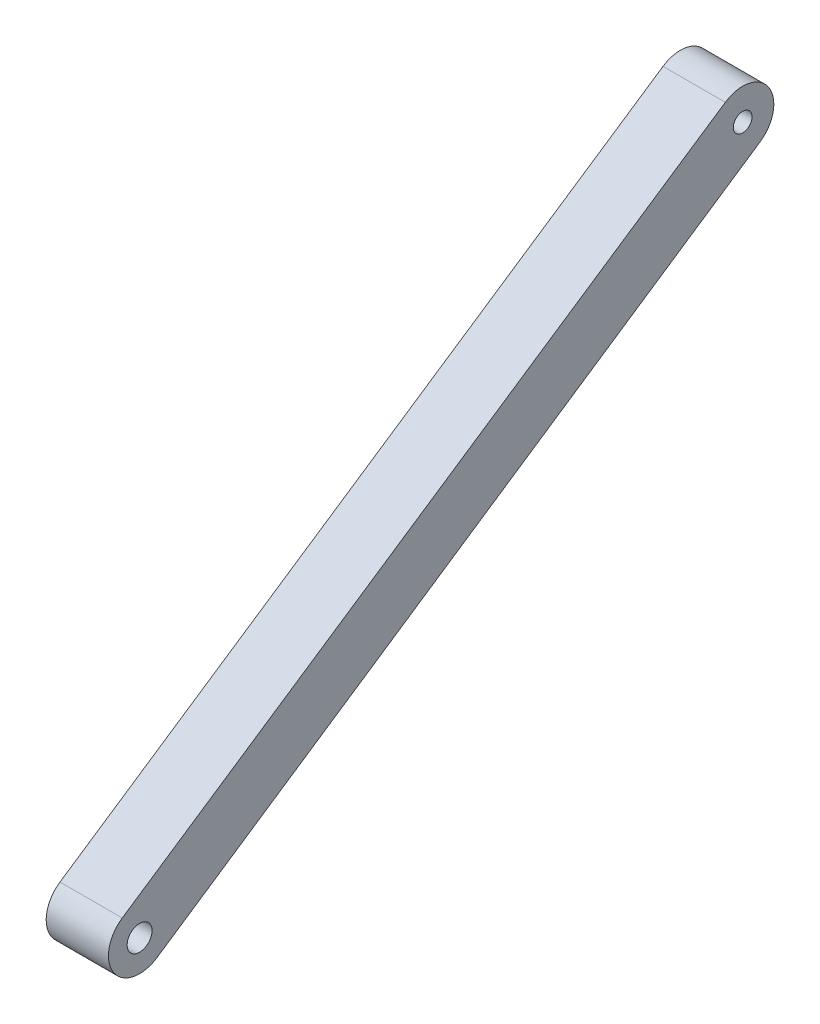
ISO-10303-21;
HEADER;
FILE_DESCRIPTION(('STEP AP214'),'2;1');
FILE_NAME('part.step','',(''),(''),'','','');
FILE_SCHEMA(('AUTOMOTIVE_DESIGN { 1 0 10303 214 1 1 1 1 }'));
ENDSEC;
DATA;
#1=APPLICATION_CONTEXT('core data for automotive mechanical design processes');
#2=APPLICATION_PROTOCOL_DEFINITION('international standard','automotive_design',2000,#1);
#3=PRODUCT_CONTEXT('',#1,'mechanical');
#4=PRODUCT('Part','Part','',(#3));
#5=PRODUCT_RELATED_PRODUCT_CATEGORY('part','',(#4));
#6=PRODUCT_DEFINITION_FORMATION('','',#4);
#7=PRODUCT_DEFINITION_CONTEXT('part definition',#1,'design');
#8=PRODUCT_DEFINITION('design','',#6,#7);
#9=PRODUCT_DEFINITION_SHAPE('','',#8);
#10=(LENGTH_UNIT() NAMED_UNIT(*) SI_UNIT(.MILLI.,.METRE.));
#11=(NAMED_UNIT(*) PLANE_ANGLE_UNIT() SI_UNIT($,.RADIAN.));
#12=(NAMED_UNIT(*) SI_UNIT($,.STERADIAN.) SOLID_ANGLE_UNIT());
#13=UNCERTAINTY_MEASURE_WITH_UNIT(LENGTH_MEASURE(1.E-05),#10,'distance_accuracy_value','');
#14=(GEOMETRIC_REPRESENTATION_CONTEXT(3) GLOBAL_UNCERTAINTY_ASSIGNED_CONTEXT((#13)) GLOBAL_UNIT_ASSIGNED_CONTEXT((#10,
#11,#12)) REPRESENTATION_CONTEXT('',''));
#15=CARTESIAN_POINT('',(0.,0.,0.));
#16=DIRECTION('',(0.,0.,1.));
#17=DIRECTION('',(1.,0.,0.));
#18=AXIS2_PLACEMENT_3D('',#15,#16,#17);
#19=CARTESIAN_POINT('',(-5.,26.553202892204,-27.5965246151337));
#20=DIRECTION('',(1.,0.,0.));
#21=DIRECTION('',(0.,0.,-1.));
#22=AXIS2_PLACEMENT_3D('',#19,#20,#21);
#23=CYLINDRICAL_SURFACE('',#22,5.);
#24=DIRECTION('',(1.,0.,0.));
#25=VECTOR('',#24,1.);
#26=CARTESIAN_POINT('',(-5.,30.7045315820796,-24.8096858848489));
#27=LINE('',#26,#25);
#28=CARTESIAN_POINT('',(-5.,30.7045315820796,-24.8096858848489));
#29=VERTEX_POINT('',#28);
#30=CARTESIAN_POINT('',(5.,30.7045315820796,-24.8096858848489));
#31=VERTEX_POINT('',#30);
#32=EDGE_CURVE('E36',#29,#31,#27,.T.);
#33=ORIENTED_EDGE('',*,*,#32,.T.);
#34=CARTESIAN_POINT('',(5.,26.553202892204,-27.5965246151337));
#35=DIRECTION('',(1.,0.,0.));
#36=DIRECTION('',(0.,0.,-1.));
#37=AXIS2_PLACEMENT_3D('',#34,#35,#36);
#38=CIRCLE('',#37,5.);
#39=CARTESIAN_POINT('',(5.,22.4018742023284,-30.3833633454185));
#40=VERTEX_POINT('',#39);
#41=EDGE_CURVE('E73',#40,#31,#38,.T.);
#42=ORIENTED_EDGE('',*,*,#41,.F.);
#43=DIRECTION('',(1.,0.,0.));
#44=VECTOR('',#43,1.);
#45=CARTESIAN_POINT('',(-5.,22.4018742023284,-30.3833633454185));
#46=LINE('',#45,#44);
#47=CARTESIAN_POINT('',(-5.,22.4018742023284,-30.3833633454185));
#48=VERTEX_POINT('',#47);
#49=EDGE_CURVE('E11',#48,#40,#46,.T.);
#50=ORIENTED_EDGE('',*,*,#49,.F.);
#51=CARTESIAN_POINT('',(-5.,26.553202892204,-27.5965246151337));
#52=DIRECTION('',(1.,0.,0.));
#53=DIRECTION('',(0.,0.,-1.));
#54=AXIS2_PLACEMENT_3D('',#51,#52,#53);
#55=CIRCLE('',#54,5.);
#56=EDGE_CURVE('E74',#48,#29,#55,.T.);
#57=ORIENTED_EDGE('',*,*,#56,.T.);
#58=EDGE_LOOP('',(#33,#42,#50,#57));
#59=FACE_BOUND('',#58,.T.);
#60=ADVANCED_FACE('F33',(#59),#23,.T.);
#61=CARTESIAN_POINT('',(-5.,22.4018742023284,-30.3833633454185));
#62=DIRECTION('',(0.,-0.830265737975125,-0.557367746056965));
#63=DIRECTION('',(0.,0.557367746056965,-0.830265737975125));
#64=AXIS2_PLACEMENT_3D('',#61,#62,#63);
#65=PLANE('',#64);
#66=ORIENTED_EDGE('',*,*,#49,.T.);
#67=DIRECTION('',(0.,0.557367746056965,-0.830265737975125));
#68=VECTOR('',#67,1.);
#69=CARTESIAN_POINT('',(5.,22.4018742023284,-30.3833633454185));
#70=LINE('',#69,#68);
#71=CARTESIAN_POINT('',(5.,-42.602771831482,66.4488103727165));
#72=VERTEX_POINT('',#71);
#73=EDGE_CURVE('E91',#72,#40,#70,.T.);
#74=ORIENTED_EDGE('',*,*,#73,.F.);
#75=DIRECTION('',(1.,0.,0.));
#76=VECTOR('',#75,1.);
#77=CARTESIAN_POINT('',(-5.,-42.602771831482,66.4488103727165));
#78=LINE('',#77,#76);
#79=CARTESIAN_POINT('',(-5.,-42.602771831482,66.4488103727165));
#80=VERTEX_POINT('',#79);
#81=EDGE_CURVE('E41',#80,#72,#78,.T.);
#82=ORIENTED_EDGE('',*,*,#81,.F.);
#83=DIRECTION('',(0.,0.557367746056965,-0.830265737975125));
#84=VECTOR('',#83,1.);
#85=CARTESIAN_POINT('',(-5.,22.4018742023284,-30.3833633454185));
#86=LINE('',#85,#84);
#87=EDGE_CURVE('E79',#80,#48,#86,.T.);
#88=ORIENTED_EDGE('',*,*,#87,.T.);
#89=EDGE_LOOP('',(#66,#74,#82,#88));
#90=FACE_BOUND('',#89,.T.);
#91=ADVANCED_FACE('F117',(#90),#65,.T.);
#92=CARTESIAN_POINT('',(-5.,-38.4514431416064,69.2356491030014));
#93=DIRECTION('',(1.,0.,0.));
#94=DIRECTION('',(0.,0.,-1.));
#95=AXIS2_PLACEMENT_3D('',#92,#93,#94);
#96=CYLINDRICAL_SURFACE('',#95,5.);
#97=ORIENTED_EDGE('',*,*,#81,.T.);
#98=CARTESIAN_POINT('',(5.,-38.4514431416064,69.2356491030014));
#99=DIRECTION('',(1.,0.,0.));
#100=DIRECTION('',(0.,0.,-1.));
#101=AXIS2_PLACEMENT_3D('',#98,#99,#100);
#102=CIRCLE('',#101,5.);
#103=CARTESIAN_POINT('',(5.,-34.3001144517308,72.0224878332862));
#104=VERTEX_POINT('',#103);
#105=EDGE_CURVE('E86',#104,#72,#102,.T.);
#106=ORIENTED_EDGE('',*,*,#105,.F.);
#107=DIRECTION('',(1.,0.,0.));
#108=VECTOR('',#107,1.);
#109=CARTESIAN_POINT('',(-5.,-34.3001144517308,72.0224878332862));
#110=LINE('',#109,#108);
#111=CARTESIAN_POINT('',(-5.,-34.3001144517308,72.0224878332862));
#112=VERTEX_POINT('',#111);
#113=EDGE_CURVE('E78',#112,#104,#110,.T.);
#114=ORIENTED_EDGE('',*,*,#113,.F.);
#115=CARTESIAN_POINT('',(-5.,-38.4514431416064,69.2356491030014));
#116=DIRECTION('',(1.,0.,0.));
#117=DIRECTION('',(0.,0.,-1.));
#118=AXIS2_PLACEMENT_3D('',#115,#116,#117);
#119=CIRCLE('',#118,5.);
#120=EDGE_CURVE('E110',#112,#80,#119,.T.);
#121=ORIENTED_EDGE('',*,*,#120,.T.);
#122=EDGE_LOOP('',(#97,#106,#114,#121));
#123=FACE_BOUND('',#122,.T.);
#124=ADVANCED_FACE('F114',(#123),#96,.T.);
#125=CARTESIAN_POINT('',(-5.,30.7045315820796,-24.8096858848489));
#126=DIRECTION('',(0.,0.830265737975125,0.557367746056965));
#127=DIRECTION('',(0.,-0.557367746056965,0.830265737975125));
#128=AXIS2_PLACEMENT_3D('',#125,#126,#127);
#129=PLANE('',#128);
#130=ORIENTED_EDGE('',*,*,#113,.T.);
#131=DIRECTION('',(0.,-0.557367746056965,0.830265737975125));
#132=VECTOR('',#131,1.);
#133=CARTESIAN_POINT('',(5.,30.7045315820796,-24.8096858848489));
#134=LINE('',#133,#132);
#135=EDGE_CURVE('E81',#31,#104,#134,.T.);
#136=ORIENTED_EDGE('',*,*,#135,.F.);
#137=ORIENTED_EDGE('',*,*,#32,.F.);
#138=DIRECTION('',(0.,-0.557367746056965,0.830265737975125));
#139=VECTOR('',#138,1.);
#140=CARTESIAN_POINT('',(-5.,30.7045315820796,-24.8096858848489));
#141=LINE('',#140,#139);
#142=EDGE_CURVE('E108',#29,#112,#141,.T.);
#143=ORIENTED_EDGE('',*,*,#142,.T.);
#144=EDGE_LOOP('',(#130,#136,#137,#143));
#145=FACE_BOUND('',#144,.T.);
#146=ADVANCED_FACE('F82',(#145),#129,.T.);
#147=CARTESIAN_POINT('',(-5.,26.553202892204,-27.5965246151337));
#148=DIRECTION('',(1.,0.,0.));
#149=DIRECTION('',(0.,0.,-1.));
#150=AXIS2_PLACEMENT_3D('',#147,#148,#149);
#151=PLANE('',#150);
#152=CARTESIAN_POINT('',(-5.,-38.4514431416064,69.2356491030014));
#153=DIRECTION('',(1.,0.,0.));
#154=DIRECTION('',(0.,0.,-1.));
#155=AXIS2_PLACEMENT_3D('',#152,#153,#154);
#156=CIRCLE('',#155,2.);
#157=CARTESIAN_POINT('',(-5.,-38.4514431416064,67.2356491030014));
#158=VERTEX_POINT('',#157);
#159=EDGE_CURVE('E101',#158,#158,#156,.T.);
#160=ORIENTED_EDGE('',*,*,#159,.T.);
#161=EDGE_LOOP('',(#160));
#162=FACE_BOUND('',#161,.T.);
#163=CARTESIAN_POINT('',(-5.,26.553202892204,-27.5965246151337));
#164=DIRECTION('',(1.,0.,0.));
#165=DIRECTION('',(0.,0.,-1.));
#166=AXIS2_PLACEMENT_3D('',#163,#164,#165);
#167=CIRCLE('',#166,1.5);
#168=CARTESIAN_POINT('',(-5.,26.553202892204,-29.0965246151337));
#169=VERTEX_POINT('',#168);
#170=EDGE_CURVE('E104',#169,#169,#167,.T.);
#171=ORIENTED_EDGE('',*,*,#170,.T.);
#172=EDGE_LOOP('',(#171));
#173=FACE_BOUND('',#172,.T.);
#174=ORIENTED_EDGE('',*,*,#56,.F.);
#175=ORIENTED_EDGE('',*,*,#87,.F.);
#176=ORIENTED_EDGE('',*,*,#120,.F.);
#177=ORIENTED_EDGE('',*,*,#142,.F.);
#178=EDGE_LOOP('',(#174,#175,#176,#177));
#179=FACE_BOUND('',#178,.T.);
#180=ADVANCED_FACE('F119',(#162,#173,#179),#151,.F.);
#181=CARTESIAN_POINT('',(-5.,26.553202892204,-27.5965246151337));
#182=DIRECTION('',(1.,0.,0.));
#183=DIRECTION('',(0.,0.,-1.));
#184=AXIS2_PLACEMENT_3D('',#181,#182,#183);
#185=CYLINDRICAL_SURFACE('',#184,1.5);
#186=ORIENTED_EDGE('',*,*,#170,.F.);
#187=EDGE_LOOP('',(#186));
#188=FACE_BOUND('',#187,.T.);
#189=CARTESIAN_POINT('',(5.,26.553202892204,-27.5965246151337));
#190=DIRECTION('',(1.,0.,0.));
#191=DIRECTION('',(0.,0.,-1.));
#192=AXIS2_PLACEMENT_3D('',#189,#190,#191);
#193=CIRCLE('',#192,1.5);
#194=CARTESIAN_POINT('',(5.,26.553202892204,-29.0965246151337));
#195=VERTEX_POINT('',#194);
#196=EDGE_CURVE('E92',#195,#195,#193,.T.);
#197=ORIENTED_EDGE('',*,*,#196,.T.);
#198=EDGE_LOOP('',(#197));
#199=FACE_BOUND('',#198,.T.);
#200=ADVANCED_FACE('F121',(#188,#199),#185,.F.);
#201=CARTESIAN_POINT('',(-5.,-38.4514431416064,69.2356491030014));
#202=DIRECTION('',(1.,0.,0.));
#203=DIRECTION('',(0.,0.,-1.));
#204=AXIS2_PLACEMENT_3D('',#201,#202,#203);
#205=CYLINDRICAL_SURFACE('',#204,2.);
#206=ORIENTED_EDGE('',*,*,#159,.F.);
#207=EDGE_LOOP('',(#206));
#208=FACE_BOUND('',#207,.T.);
#209=CARTESIAN_POINT('',(5.,-38.4514431416064,69.2356491030014));
#210=DIRECTION('',(1.,0.,0.));
#211=DIRECTION('',(0.,0.,-1.));
#212=AXIS2_PLACEMENT_3D('',#209,#210,#211);
#213=CIRCLE('',#212,2.);
#214=CARTESIAN_POINT('',(5.,-38.4514431416064,67.2356491030014));
#215=VERTEX_POINT('',#214);
#216=EDGE_CURVE('E95',#215,#215,#213,.T.);
#217=ORIENTED_EDGE('',*,*,#216,.T.);
#218=EDGE_LOOP('',(#217));
#219=FACE_BOUND('',#218,.T.);
#220=ADVANCED_FACE('F128',(#208,#219),#205,.F.);
#221=CARTESIAN_POINT('',(5.,26.553202892204,-27.5965246151337));
#222=DIRECTION('',(1.,0.,0.));
#223=DIRECTION('',(0.,0.,-1.));
#224=AXIS2_PLACEMENT_3D('',#221,#222,#223);
#225=PLANE('',#224);
#226=ORIENTED_EDGE('',*,*,#196,.F.);
#227=EDGE_LOOP('',(#226));
#228=FACE_BOUND('',#227,.T.);
#229=ORIENTED_EDGE('',*,*,#41,.T.);
#230=ORIENTED_EDGE('',*,*,#135,.T.);
#231=ORIENTED_EDGE('',*,*,#105,.T.);
#232=ORIENTED_EDGE('',*,*,#73,.T.);
#233=EDGE_LOOP('',(#229,#230,#231,#232));
#234=FACE_BOUND('',#233,.T.);
#235=ORIENTED_EDGE('',*,*,#216,.F.);
#236=EDGE_LOOP('',(#235));
#237=FACE_BOUND('',#236,.T.);
#238=ADVANCED_FACE('F89',(#228,#234,#237),#225,.T.);
#239=CLOSED_SHELL('',(#60,#91,#124,#146,#180,#200,#220,#238));
#240=MANIFOLD_SOLID_BREP('B2',#239);
#241=ADVANCED_BREP_SHAPE_REPRESENTATION('',(#18,#240),#14);
#242=SHAPE_DEFINITION_REPRESENTATION(#9,#241);
ENDSEC;
END-ISO-10303-21;
